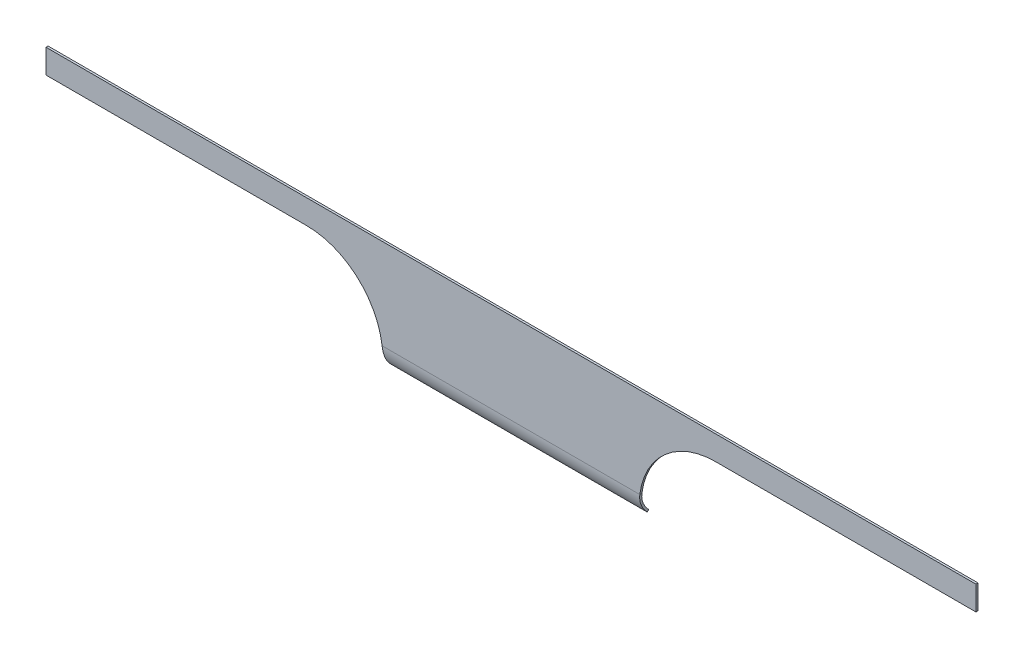
ISO-10303-21;
HEADER;
FILE_DESCRIPTION(('STEP AP214'),'2;1');
FILE_NAME('part.step','',(''),(''),'','','');
FILE_SCHEMA(('AUTOMOTIVE_DESIGN { 1 0 10303 214 1 1 1 1 }'));
ENDSEC;
DATA;
#1=APPLICATION_CONTEXT('core data for automotive mechanical design processes');
#2=APPLICATION_PROTOCOL_DEFINITION('international standard','automotive_design',2000,#1);
#3=PRODUCT_CONTEXT('',#1,'mechanical');
#4=PRODUCT('Part','Part','',(#3));
#5=PRODUCT_RELATED_PRODUCT_CATEGORY('part','',(#4));
#6=PRODUCT_DEFINITION_FORMATION('','',#4);
#7=PRODUCT_DEFINITION_CONTEXT('part definition',#1,'design');
#8=PRODUCT_DEFINITION('design','',#6,#7);
#9=PRODUCT_DEFINITION_SHAPE('','',#8);
#10=(LENGTH_UNIT() NAMED_UNIT(*) SI_UNIT(.MILLI.,.METRE.));
#11=(NAMED_UNIT(*) PLANE_ANGLE_UNIT() SI_UNIT($,.RADIAN.));
#12=(NAMED_UNIT(*) SI_UNIT($,.STERADIAN.) SOLID_ANGLE_UNIT());
#13=UNCERTAINTY_MEASURE_WITH_UNIT(LENGTH_MEASURE(1.E-05),#10,'distance_accuracy_value','');
#14=(GEOMETRIC_REPRESENTATION_CONTEXT(3) GLOBAL_UNCERTAINTY_ASSIGNED_CONTEXT((#13)) GLOBAL_UNIT_ASSIGNED_CONTEXT((#10,
#11,#12)) REPRESENTATION_CONTEXT('',''));
#15=CARTESIAN_POINT('',(0.,0.,0.));
#16=DIRECTION('',(0.,0.,1.));
#17=DIRECTION('',(1.,0.,0.));
#18=AXIS2_PLACEMENT_3D('',#15,#16,#17);
#19=CARTESIAN_POINT('',(749.3,-114.299999999998,-114.299999999998));
#20=DIRECTION('',(-1.,0.,0.));
#21=DIRECTION('',(0.,0.,1.));
#22=AXIS2_PLACEMENT_3D('',#19,#20,#21);
#23=PLANE('',#22);
#24=CARTESIAN_POINT('',(749.299999999999,-114.3,-32.3402844362754));
#25=DIRECTION('',(-1.,0.,0.));
#26=DIRECTION('',(0.,0.,1.));
#27=AXIS2_PLACEMENT_3D('',#24,#25,#26);
#28=CIRCLE('',#27,34.9971244362754);
#29=CARTESIAN_POINT('',(749.300000000001,-127.692819702182,-0.00715747285004106));
#30=VERTEX_POINT('',#29);
#31=CARTESIAN_POINT('',(749.3,-139.046703834143,-7.59358060213253));
#32=VERTEX_POINT('',#31);
#33=EDGE_CURVE('E518',#30,#32,#28,.F.);
#34=ORIENTED_EDGE('',*,*,#33,.T.);
#35=CARTESIAN_POINT('',(749.3,-137.168034430392,-9.47225000588337));
#36=CARTESIAN_POINT('',(749.3,-137.794257623901,-8.84602681237416));
#37=CARTESIAN_POINT('',(749.3,-138.420480817411,-8.21980361886492));
#38=CARTESIAN_POINT('',(749.3,-139.04670401092,-7.59358042535571));
#39=B_SPLINE_CURVE_WITH_KNOTS('',3,(#35,#36,#37,#38),.UNSPECIFIED.,.F.,.F.,(4,4),(0.,1.),.UNSPECIFIED.);
#40=CARTESIAN_POINT('',(749.3,-137.168034430392,-9.47225000588349));
#41=VERTEX_POINT('',#40);
#42=EDGE_CURVE('E436',#41,#32,#39,.T.);
#43=ORIENTED_EDGE('',*,*,#42,.F.);
#44=CARTESIAN_POINT('',(749.299999999999,-114.3,-32.3402844362754));
#45=DIRECTION('',(-1.,0.,0.));
#46=DIRECTION('',(0.,0.,1.));
#47=AXIS2_PLACEMENT_3D('',#44,#45,#46);
#48=CIRCLE('',#47,32.3402844362754);
#49=CARTESIAN_POINT('',(749.300000000001,-126.676091051737,-2.46175757000735));
#50=VERTEX_POINT('',#49);
#51=EDGE_CURVE('E439',#50,#41,#48,.F.);
#52=ORIENTED_EDGE('',*,*,#51,.F.);
#53=DIRECTION('',(0.,0.382683432365078,-0.923879532511291));
#54=VECTOR('',#53,1.);
#55=CARTESIAN_POINT('',(749.300000000002,-127.692819701554,-0.00715747436655367));
#56=LINE('',#55,#54);
#57=EDGE_CURVE('E365',#50,#30,#56,.F.);
#58=ORIENTED_EDGE('',*,*,#57,.T.);
#59=EDGE_LOOP('',(#34,#43,#52,#58));
#60=FACE_BOUND('',#59,.T.);
#61=ADVANCED_FACE('F362',(#60),#23,.F.);
#62=CARTESIAN_POINT('',(752.642105263158,-101.820835351228,-0.265684));
#63=CARTESIAN_POINT('',(752.35165142943,-102.941770559072,-0.265847158777117));
#64=CARTESIAN_POINT('',(751.770743761973,-105.183640974759,-0.266173476331351));
#65=CARTESIAN_POINT('',(751.053633083937,-108.583670187395,-0.263726094674595));
#66=CARTESIAN_POINT('',(750.517192648634,-111.624238479452,-0.271992868014699));
#67=CARTESIAN_POINT('',(750.103683149232,-114.485241778502,-0.249196809285274));
#68=CARTESIAN_POINT('',(749.764194512313,-117.338946878089,-0.352101846930876));
#69=CARTESIAN_POINT('',(749.489318849619,-120.554742577071,-0.820528666951754));
#70=CARTESIAN_POINT('',(749.331781106174,-123.7093110237,-1.62203803450702));
#71=CARTESIAN_POINT('',(749.28850273558,-126.410779792222,-2.60261755904269));
#72=CARTESIAN_POINT('',(749.322884462717,-129.023854877735,-3.79521351634573));
#73=CARTESIAN_POINT('',(749.454288081686,-131.683148461634,-5.3165192780289));
#74=CARTESIAN_POINT('',(749.717888045478,-134.487601966932,-7.31619782676426));
#75=CARTESIAN_POINT('',(749.998744026105,-136.149303159838,-8.87880198615915));
#76=CARTESIAN_POINT('',(750.139174334666,-136.980167472339,-9.66011696393598));
#77=CARTESIAN_POINT('',(752.642105263158,-101.820835351228,0.797052));
#78=CARTESIAN_POINT('',(752.351651429429,-102.941979008405,0.796883435241084));
#79=CARTESIAN_POINT('',(751.770743761973,-105.184266322757,0.796546305723252));
#80=CARTESIAN_POINT('',(751.053633083937,-108.581168795399,0.799074777106988));
#81=CARTESIAN_POINT('',(750.517192648634,-111.632298599494,0.790534098635943));
#82=CARTESIAN_POINT('',(750.103683149232,-114.46417797815,0.814085465052461));
#83=CARTESIAN_POINT('',(749.764194512312,-117.449353090162,0.707770848281948));
#84=CARTESIAN_POINT('',(749.489318849619,-120.759163645919,0.223823521747173));
#85=CARTESIAN_POINT('',(749.331781106173,-124.021693315314,-0.604242462185344));
#86=CARTESIAN_POINT('',(749.28850273558,-126.811931679671,-1.61731178074527));
#87=CARTESIAN_POINT('',(749.322884462716,-129.511749054811,-2.84942232716383));
#88=CARTESIAN_POINT('',(749.454288081687,-132.259094864788,-4.42113390460006));
#89=CARTESIAN_POINT('',(749.717888045478,-135.15648646759,-6.48706831789067));
#90=CARTESIAN_POINT('',(749.998744026105,-136.873242911906,-8.1014466434903));
#91=CARTESIAN_POINT('',(750.139174334666,-137.73163530455,-8.90864913172489));
#92=CARTESIAN_POINT('',(752.642105263158,-101.820835351228,1.859788));
#93=CARTESIAN_POINT('',(752.351651429429,-102.942187457737,1.85961402925928));
#94=CARTESIAN_POINT('',(751.770743761973,-105.184891670756,1.85926608777785));
#95=CARTESIAN_POINT('',(751.053633083937,-108.578667403404,1.86187564888858));
#96=CARTESIAN_POINT('',(750.517192648634,-111.640358719535,1.85306106528659));
#97=CARTESIAN_POINT('',(750.103683149232,-114.443114177799,1.87736773939019));
#98=CARTESIAN_POINT('',(749.764194512312,-117.559759302236,1.76764354349477));
#99=CARTESIAN_POINT('',(749.489318849619,-120.963584714768,1.26817571044609));
#100=CARTESIAN_POINT('',(749.331781106174,-124.334075606928,0.413553110136556));
#101=CARTESIAN_POINT('',(749.28850273558,-127.213083567119,-0.632006002447921));
#102=CARTESIAN_POINT('',(749.322884462716,-129.999643231887,-1.90363113798154));
#103=CARTESIAN_POINT('',(749.454288081687,-132.835041267942,-3.52574853117141));
#104=CARTESIAN_POINT('',(749.717888045478,-135.825370968247,-5.65793880901705));
#105=CARTESIAN_POINT('',(749.998744026105,-137.597182663974,-7.32409130082148));
#106=CARTESIAN_POINT('',(750.139174334666,-138.483103136761,-8.15718129951385));
#107=CARTESIAN_POINT('',(752.642105263158,-101.820835351228,2.922524));
#108=CARTESIAN_POINT('',(752.35165142943,-102.94239590707,2.92234462327749));
#109=CARTESIAN_POINT('',(751.770743761973,-105.185517018755,2.92198586983246));
#110=CARTESIAN_POINT('',(751.053633083937,-108.576166011408,2.92467652067016));
#111=CARTESIAN_POINT('',(750.517192648634,-111.648418839576,2.91558803193723));
#112=CARTESIAN_POINT('',(750.103683149232,-114.422050377447,2.94065001372793));
#113=CARTESIAN_POINT('',(749.764194512313,-117.67016551431,2.8275162387076));
#114=CARTESIAN_POINT('',(749.489318849619,-121.168005783616,2.31252789914504));
#115=CARTESIAN_POINT('',(749.331781106174,-124.646457898543,1.43134868245818));
#116=CARTESIAN_POINT('',(749.28850273558,-127.614235454568,0.353299775849551));
#117=CARTESIAN_POINT('',(749.322884462717,-130.487537408963,-0.957839948799706));
#118=CARTESIAN_POINT('',(749.454288081686,-133.410987671096,-2.63036315774251));
#119=CARTESIAN_POINT('',(749.717888045478,-136.494255468905,-4.82880930014346));
#120=CARTESIAN_POINT('',(749.998744026105,-138.321122416041,-6.54673595815262));
#121=CARTESIAN_POINT('',(750.139174334666,-139.234570968972,-7.40571346730275));
#122=B_SPLINE_SURFACE_WITH_KNOTS('',3,3,((#62,#63,#64,#65,#66,#67,#68,#69,#70,#71,#72,#73,#74,
#75,#76),(#77,#78,#79,#80,#81,#82,#83,#84,#85,#86,#87,#88,#89,#90,#91),(#92,#93,#94,#95,#96,#97,
#98,#99,#100,#101,#102,#103,#104,#105,#106),(#107,#108,#109,#110,#111,#112,#113,#114,#115,#116,
#117,#118,#119,#120,#121)),.UNSPECIFIED.,.F.,.F.,.F.,(4,4),(4,1,1,1,1,1,1,1,1,1,1,1,4),(0.,1.),
(0.,0.0912904484822667,0.182580896964533,0.273871345446799,0.334733469237831,0.410342055574255,
0.50105502548557,0.591765935503214,0.66736995496146,0.727861231753743,0.818571907646757,
0.909284456275887,1.),.UNSPECIFIED.);
#123=CARTESIAN_POINT('',(750.139174343774,-114.299999931334,0.));
#124=CARTESIAN_POINT('',(750.103704632582,-114.567432528298,1.57905755249053E-07));
#125=CARTESIAN_POINT('',(750.069355485839,-114.835001038879,-0.00331745296929931));
#126=CARTESIAN_POINT('',(750.002885611845,-115.370251015036,-0.0166053083627542));
#127=CARTESIAN_POINT('',(749.970764896204,-115.637932481192,-0.0265755875363228));
#128=CARTESIAN_POINT('',(749.877731267279,-116.440865854028,-0.066489132934349));
#129=CARTESIAN_POINT('',(749.820141844401,-116.976044714273,-0.106435102235734));
#130=CARTESIAN_POINT('',(749.71459912258,-118.038904471104,-0.212464674561346));
#131=CARTESIAN_POINT('',(749.666549472877,-118.566604399469,-0.278264552878381));
#132=CARTESIAN_POINT('',(749.579312664754,-119.618830451784,-0.435942625497227));
#133=CARTESIAN_POINT('',(749.540125336735,-120.143356636284,-0.527820320672228));
#134=CARTESIAN_POINT('',(749.471326601256,-121.176270593268,-0.73518623304615));
#135=CARTESIAN_POINT('',(749.441523093267,-121.684759187824,-0.8501091513582));
#136=CARTESIAN_POINT('',(749.390361852085,-122.695986422047,-1.10451566553655));
#137=CARTESIAN_POINT('',(749.369004112088,-123.198725066346,-1.24399924161832));
#138=CARTESIAN_POINT('',(749.334594954039,-124.20239771723,-1.54881801168919));
#139=CARTESIAN_POINT('',(749.321633566924,-124.70325669753,-1.71441047311375));
#140=CARTESIAN_POINT('',(749.304346959965,-125.696424502577,-2.06993610885764));
#141=CARTESIAN_POINT('',(749.300021941288,-126.188733127894,-2.25986985004641));
#142=CARTESIAN_POINT('',(749.3,-126.676091051737,-2.46175757000738));
#143=B_SPLINE_CURVE_WITH_KNOTS('',3,(#123,#124,#125,#126,#127,#128,#129,#130,#131,#132,#133,
#134,#135,#136,#137,#138,#139,#140,#141,#142),.UNSPECIFIED.,.F.,.F.,(4,2,2,2,2,2,2,2,2,4),(0.,
0.8092754944921,1.61855520470578,3.23699983418201,4.83815836895134,6.43928625977264,
8.00510837122301,9.57092922135052,11.1532734279099,12.735654491431),.UNSPECIFIED.);
#144=CARTESIAN_POINT('',(750.13917433922,-114.299999965667,0.));
#145=VERTEX_POINT('',#144);
#146=EDGE_CURVE('E431',#145,#50,#143,.T.);
#147=DIRECTION('',(0.,0.,1.));
#148=VECTOR('',#147,1.);
#149=CARTESIAN_POINT('',(750.139174334666,-114.3,0.));
#150=LINE('',#149,#148);
#151=CARTESIAN_POINT('',(750.13917433906,-114.299999965647,2.65684000000067));
#152=VERTEX_POINT('',#151);
#153=EDGE_CURVE('E460',#145,#152,#150,.T.);
#154=CARTESIAN_POINT('',(750.139174343453,-114.299999931295,2.65684));
#155=CARTESIAN_POINT('',(750.105043301277,-114.56722252938,2.65684201995193));
#156=CARTESIAN_POINT('',(750.0725448687,-114.834647522195,2.65377949819717));
#157=CARTESIAN_POINT('',(750.010282157964,-115.369667740193,2.64151209395863));
#158=CARTESIAN_POINT('',(749.980517799248,-115.637262960128,2.63230739250981));
#159=CARTESIAN_POINT('',(749.923191054517,-116.172397084951,2.6077427098769));
#160=CARTESIAN_POINT('',(749.895628604594,-116.43993599125,2.59238290741219));
#161=CARTESIAN_POINT('',(749.842370922068,-116.974777101442,2.55550526347968));
#162=CARTESIAN_POINT('',(749.81667570805,-117.242079302953,2.53398736073151));
#163=CARTESIAN_POINT('',(749.767191558973,-117.773669137117,2.4850352582151));
#164=CARTESIAN_POINT('',(749.743386482676,-118.037960755045,2.457660777381));
#165=CARTESIAN_POINT('',(749.697527426828,-118.565994840963,2.39688069045409));
#166=CARTESIAN_POINT('',(749.67547343381,-118.829737313161,2.36347513075089));
#167=CARTESIAN_POINT('',(749.612046726469,-119.619945835163,2.25421918153419));
#168=CARTESIAN_POINT('',(749.573407541773,-120.145411596573,2.16932780960912));
#169=CARTESIAN_POINT('',(749.498959715884,-121.266041357752,1.96192752679411));
#170=CARTESIAN_POINT('',(749.464313288404,-121.860615019241,1.83580734576511));
#171=CARTESIAN_POINT('',(749.404908240227,-123.042880898255,1.55263946507261));
#172=CARTESIAN_POINT('',(749.380150117875,-123.630572767509,1.39559020726272));
#173=CARTESIAN_POINT('',(749.3402152506,-124.803814843392,1.04903728633412));
#174=CARTESIAN_POINT('',(749.325148983596,-125.389267251452,0.859189660476841));
#175=CARTESIAN_POINT('',(749.305048787002,-126.549495251603,0.448854424367313));
#176=CARTESIAN_POINT('',(749.300014646462,-127.124271067947,0.228367458491751));
#177=CARTESIAN_POINT('',(749.3,-127.692819702182,-0.00715747285006353));
#178=B_SPLINE_CURVE_WITH_KNOTS('',3,(#154,#155,#156,#157,#158,#159,#160,#161,#162,#163,#164,
#165,#166,#167,#168,#169,#170,#171,#172,#173,#174,#175,#176,#177),.UNSPECIFIED.,.F.,.F.,(4,2,2,
2,2,2,2,2,2,2,2,4),(0.,0.808149184674305,1.61627455096609,2.42437645424765,3.23248639937682,
4.03271861271704,4.83294467112422,6.43334054783391,8.25879952081505,10.084350480384,
11.9303585668227,13.7763278356955),.UNSPECIFIED.);
#179=EDGE_CURVE('E432',#152,#30,#178,.T.);
#180=ORIENTED_EDGE('',*,*,#57,.F.);
#181=ORIENTED_EDGE('',*,*,#146,.F.);
#182=ORIENTED_EDGE('',*,*,#153,.T.);
#183=ORIENTED_EDGE('',*,*,#179,.T.);
#184=EDGE_LOOP('',(#180,#181,#182,#183));
#185=FACE_BOUND('',#184,.T.);
#186=ADVANCED_FACE('F429',(#185),#122,.T.);
#187=CARTESIAN_POINT('',(-1.3331028809031E-13,-139.046704010912,-7.59358042535259));
#188=DIRECTION('',(0.,0.707106781186548,0.707106781186547));
#189=DIRECTION('',(0.,-0.707106781186547,0.707106781186548));
#190=AXIS2_PLACEMENT_3D('',#187,#188,#189);
#191=PLANE('',#190);
#192=ORIENTED_EDGE('',*,*,#42,.T.);
#193=DIRECTION('',(-1.,0.,0.));
#194=VECTOR('',#193,1.);
#195=CARTESIAN_POINT('',(750.139174335345,-139.04670401092,-7.59358042535597));
#196=LINE('',#195,#194);
#197=CARTESIAN_POINT('',(425.450000000001,-139.046704010918,-7.59358042535289));
#198=VERTEX_POINT('',#197);
#199=EDGE_CURVE('E577',#198,#32,#196,.F.);
#200=ORIENTED_EDGE('',*,*,#199,.F.);
#201=CARTESIAN_POINT('',(425.450000000002,-137.168034430389,-9.47225000588202));
#202=CARTESIAN_POINT('',(425.450000000002,-137.794257623898,-8.84602681237281));
#203=CARTESIAN_POINT('',(425.450000000002,-138.420480817407,-8.21980361886359));
#204=CARTESIAN_POINT('',(425.450000000002,-139.046704010917,-7.59358042535438));
#205=B_SPLINE_CURVE_WITH_KNOTS('',3,(#201,#202,#203,#204),.UNSPECIFIED.,.F.,.F.,(4,4),(0.,1.),.UNSPECIFIED.);
#206=CARTESIAN_POINT('',(425.450000000001,-137.16803443039,-9.47225000588065));
#207=VERTEX_POINT('',#206);
#208=EDGE_CURVE('E585',#207,#198,#205,.T.);
#209=ORIENTED_EDGE('',*,*,#208,.F.);
#210=DIRECTION('',(1.,0.,0.));
#211=VECTOR('',#210,1.);
#212=CARTESIAN_POINT('',(-1.2234711970686E-13,-137.168034430384,-9.47225000588052));
#213=LINE('',#212,#211);
#214=EDGE_CURVE('E442',#207,#41,#213,.T.);
#215=ORIENTED_EDGE('',*,*,#214,.T.);
#216=EDGE_LOOP('',(#192,#200,#209,#215));
#217=FACE_BOUND('',#216,.T.);
#218=ADVANCED_FACE('F526',(#217),#191,.F.);
#219=CARTESIAN_POINT('',(845.82,-127.,0.));
#220=DIRECTION('',(0.,0.,1.));
#221=DIRECTION('',(1.,0.,0.));
#222=AXIS2_PLACEMENT_3D('',#219,#220,#221);
#223=CYLINDRICAL_SURFACE('',#222,96.52);
#224=DIRECTION('',(0.,0.,1.));
#225=VECTOR('',#224,1.);
#226=CARTESIAN_POINT('',(845.82,-30.4799999999999,0.));
#227=LINE('',#226,#225);
#228=CARTESIAN_POINT('',(845.82,-30.4799999999999,0.));
#229=VERTEX_POINT('',#228);
#230=CARTESIAN_POINT('',(845.82,-30.4799999999999,2.65684));
#231=VERTEX_POINT('',#230);
#232=EDGE_CURVE('E457',#229,#231,#227,.T.);
#233=ORIENTED_EDGE('',*,*,#232,.T.);
#234=CARTESIAN_POINT('',(845.82,-127.,2.65684));
#235=DIRECTION('',(0.,0.,1.));
#236=DIRECTION('',(1.,0.,0.));
#237=AXIS2_PLACEMENT_3D('',#234,#235,#236);
#238=CIRCLE('',#237,96.52);
#239=EDGE_CURVE('E567',#231,#152,#238,.T.);
#240=ORIENTED_EDGE('',*,*,#239,.T.);
#241=ORIENTED_EDGE('',*,*,#153,.F.);
#242=CARTESIAN_POINT('',(845.82,-127.,0.));
#243=DIRECTION('',(0.,0.,1.));
#244=DIRECTION('',(1.,0.,0.));
#245=AXIS2_PLACEMENT_3D('',#242,#243,#244);
#246=CIRCLE('',#245,96.52);
#247=EDGE_CURVE('E575',#229,#145,#246,.T.);
#248=ORIENTED_EDGE('',*,*,#247,.F.);
#249=EDGE_LOOP('',(#233,#240,#241,#248));
#250=FACE_BOUND('',#249,.T.);
#251=ADVANCED_FACE('F535',(#250),#223,.F.);
#252=CARTESIAN_POINT('',(0.,-30.48,0.));
#253=DIRECTION('',(0.,-1.,0.));
#254=DIRECTION('',(1.,0.,0.));
#255=AXIS2_PLACEMENT_3D('',#252,#253,#254);
#256=PLANE('',#255);
#257=CARTESIAN_POINT('',(845.82,-30.4799999999999,2.65684));
#258=CARTESIAN_POINT('',(955.463333333333,-30.48,2.65684));
#259=CARTESIAN_POINT('',(1065.10666666667,-30.48,2.65684));
#260=CARTESIAN_POINT('',(1174.75,-30.48,2.65684));
#261=B_SPLINE_CURVE_WITH_KNOTS('',3,(#257,#258,#259,#260),.UNSPECIFIED.,.F.,.F.,(4,4),(0.,1.),.UNSPECIFIED.);
#262=CARTESIAN_POINT('',(1174.74999983333,-30.48,2.65683983333333));
#263=VERTEX_POINT('',#262);
#264=EDGE_CURVE('E570',#231,#263,#261,.T.);
#265=ORIENTED_EDGE('',*,*,#264,.F.);
#266=ORIENTED_EDGE('',*,*,#232,.F.);
#267=CARTESIAN_POINT('',(845.82,-30.4799999999999,0.));
#268=CARTESIAN_POINT('',(955.463333333333,-30.48,0.));
#269=CARTESIAN_POINT('',(1065.10666666667,-30.48,0.));
#270=CARTESIAN_POINT('',(1174.75,-30.48,0.));
#271=B_SPLINE_CURVE_WITH_KNOTS('',3,(#267,#268,#269,#270),.UNSPECIFIED.,.F.,.F.,(4,4),(0.,1.),.UNSPECIFIED.);
#272=CARTESIAN_POINT('',(1174.74999983333,-30.48,0.));
#273=VERTEX_POINT('',#272);
#274=EDGE_CURVE('E576',#229,#273,#271,.T.);
#275=ORIENTED_EDGE('',*,*,#274,.T.);
#276=CARTESIAN_POINT('',(1174.75,-30.48,0.));
#277=CARTESIAN_POINT('',(1174.75,-30.48,0.885613333333333));
#278=CARTESIAN_POINT('',(1174.75,-30.48,1.77122666666667));
#279=CARTESIAN_POINT('',(1174.75,-30.48,2.65684));
#280=B_SPLINE_CURVE_WITH_KNOTS('',3,(#276,#277,#278,#279),.UNSPECIFIED.,.F.,.F.,(4,4),(0.,1.),.UNSPECIFIED.);
#281=EDGE_CURVE('E459',#273,#263,#280,.T.);
#282=ORIENTED_EDGE('',*,*,#281,.T.);
#283=EDGE_LOOP('',(#265,#266,#275,#282));
#284=FACE_BOUND('',#283,.T.);
#285=ADVANCED_FACE('F538',(#284),#256,.T.);
#286=CARTESIAN_POINT('',(1174.75,0.,2.65684));
#287=DIRECTION('',(-1.,0.,0.));
#288=DIRECTION('',(0.,0.,1.));
#289=AXIS2_PLACEMENT_3D('',#286,#287,#288);
#290=PLANE('',#289);
#291=CARTESIAN_POINT('',(1174.75,-30.48,0.));
#292=CARTESIAN_POINT('',(1174.75,-20.32,0.));
#293=CARTESIAN_POINT('',(1174.75,-10.16,0.));
#294=CARTESIAN_POINT('',(1174.75,0.,0.));
#295=B_SPLINE_CURVE_WITH_KNOTS('',3,(#291,#292,#293,#294),.UNSPECIFIED.,.F.,.F.,(4,4),(0.,1.),.UNSPECIFIED.);
#296=CARTESIAN_POINT('',(1174.75,-1.66666694099149E-07,0.));
#297=VERTEX_POINT('',#296);
#298=EDGE_CURVE('E693',#273,#297,#295,.T.);
#299=ORIENTED_EDGE('',*,*,#298,.T.);
#300=CARTESIAN_POINT('',(1174.75,0.,2.65684));
#301=CARTESIAN_POINT('',(1174.75,0.,1.77122666666667));
#302=CARTESIAN_POINT('',(1174.75,0.,0.885613333333333));
#303=CARTESIAN_POINT('',(1174.75,0.,0.));
#304=B_SPLINE_CURVE_WITH_KNOTS('',3,(#300,#301,#302,#303),.UNSPECIFIED.,.F.,.F.,(4,4),(0.,1.),.UNSPECIFIED.);
#305=CARTESIAN_POINT('',(1174.75,-1.66666694099149E-07,2.65684));
#306=VERTEX_POINT('',#305);
#307=EDGE_CURVE('E448',#306,#297,#304,.T.);
#308=ORIENTED_EDGE('',*,*,#307,.F.);
#309=CARTESIAN_POINT('',(1174.75,-30.48,2.65684));
#310=CARTESIAN_POINT('',(1174.75,-20.32,2.65684));
#311=CARTESIAN_POINT('',(1174.75,-10.16,2.65684));
#312=CARTESIAN_POINT('',(1174.75,0.,2.65684));
#313=B_SPLINE_CURVE_WITH_KNOTS('',3,(#309,#310,#311,#312),.UNSPECIFIED.,.F.,.F.,(4,4),(0.,1.),.UNSPECIFIED.);
#314=EDGE_CURVE('E628',#263,#306,#313,.T.);
#315=ORIENTED_EDGE('',*,*,#314,.F.);
#316=ORIENTED_EDGE('',*,*,#281,.F.);
#317=EDGE_LOOP('',(#299,#308,#315,#316));
#318=FACE_BOUND('',#317,.T.);
#319=ADVANCED_FACE('F542',(#318),#290,.F.);
#320=CARTESIAN_POINT('',(0.,0.,2.65684));
#321=DIRECTION('',(0.,-1.,0.));
#322=DIRECTION('',(0.,0.,-1.));
#323=AXIS2_PLACEMENT_3D('',#320,#321,#322);
#324=PLANE('',#323);
#325=CARTESIAN_POINT('',(1174.75,0.,0.));
#326=CARTESIAN_POINT('',(783.166666666667,0.,0.));
#327=CARTESIAN_POINT('',(391.583333333333,0.,0.));
#328=CARTESIAN_POINT('',(0.,0.,0.));
#329=B_SPLINE_CURVE_WITH_KNOTS('',3,(#325,#326,#327,#328),.UNSPECIFIED.,.F.,.F.,(4,4),(0.,1.),.UNSPECIFIED.);
#330=CARTESIAN_POINT('',(0.,0.,0.));
#331=VERTEX_POINT('',#330);
#332=EDGE_CURVE('E702',#297,#331,#329,.T.);
#333=ORIENTED_EDGE('',*,*,#332,.T.);
#334=CARTESIAN_POINT('',(0.,0.,2.65684));
#335=CARTESIAN_POINT('',(0.,0.,1.77122666666667));
#336=CARTESIAN_POINT('',(0.,0.,0.885613333333333));
#337=CARTESIAN_POINT('',(0.,0.,0.));
#338=B_SPLINE_CURVE_WITH_KNOTS('',3,(#334,#335,#336,#337),.UNSPECIFIED.,.F.,.F.,(4,4),(0.,1.),.UNSPECIFIED.);
#339=CARTESIAN_POINT('',(0.,0.,2.65684));
#340=VERTEX_POINT('',#339);
#341=EDGE_CURVE('E445',#340,#331,#338,.T.);
#342=ORIENTED_EDGE('',*,*,#341,.F.);
#343=CARTESIAN_POINT('',(1174.75,0.,2.65684));
#344=CARTESIAN_POINT('',(783.166666666667,0.,2.65684));
#345=CARTESIAN_POINT('',(391.583333333333,0.,2.65684));
#346=CARTESIAN_POINT('',(0.,0.,2.65684));
#347=B_SPLINE_CURVE_WITH_KNOTS('',3,(#343,#344,#345,#346),.UNSPECIFIED.,.F.,.F.,(4,4),(0.,1.),.UNSPECIFIED.);
#348=EDGE_CURVE('E632',#306,#340,#347,.T.);
#349=ORIENTED_EDGE('',*,*,#348,.F.);
#350=ORIENTED_EDGE('',*,*,#307,.T.);
#351=EDGE_LOOP('',(#333,#342,#349,#350));
#352=FACE_BOUND('',#351,.T.);
#353=ADVANCED_FACE('F546',(#352),#324,.F.);
#354=CARTESIAN_POINT('',(0.,0.,2.65684));
#355=DIRECTION('',(1.,0.,0.));
#356=DIRECTION('',(0.,1.,0.));
#357=AXIS2_PLACEMENT_3D('',#354,#355,#356);
#358=PLANE('',#357);
#359=CARTESIAN_POINT('',(0.,-30.48,0.));
#360=CARTESIAN_POINT('',(0.,-30.48,0.885613333333333));
#361=CARTESIAN_POINT('',(0.,-30.48,1.77122666666667));
#362=CARTESIAN_POINT('',(0.,-30.48,2.65684));
#363=B_SPLINE_CURVE_WITH_KNOTS('',3,(#359,#360,#361,#362),.UNSPECIFIED.,.F.,.F.,(4,4),(0.,1.),.UNSPECIFIED.);
#364=CARTESIAN_POINT('',(0.,-30.48,0.));
#365=VERTEX_POINT('',#364);
#366=CARTESIAN_POINT('',(0.,-30.48,2.65684));
#367=VERTEX_POINT('',#366);
#368=EDGE_CURVE('E573',#365,#367,#363,.T.);
#369=ORIENTED_EDGE('',*,*,#368,.T.);
#370=CARTESIAN_POINT('',(0.,0.,2.65684));
#371=CARTESIAN_POINT('',(0.,-10.16,2.65684));
#372=CARTESIAN_POINT('',(0.,-20.32,2.65684));
#373=CARTESIAN_POINT('',(0.,-30.48,2.65684));
#374=B_SPLINE_CURVE_WITH_KNOTS('',3,(#370,#371,#372,#373),.UNSPECIFIED.,.F.,.F.,(4,4),(0.,1.),.UNSPECIFIED.);
#375=EDGE_CURVE('E634',#340,#367,#374,.T.);
#376=ORIENTED_EDGE('',*,*,#375,.F.);
#377=ORIENTED_EDGE('',*,*,#341,.T.);
#378=CARTESIAN_POINT('',(0.,0.,0.));
#379=CARTESIAN_POINT('',(0.,-10.16,0.));
#380=CARTESIAN_POINT('',(0.,-20.32,0.));
#381=CARTESIAN_POINT('',(0.,-30.48,0.));
#382=B_SPLINE_CURVE_WITH_KNOTS('',3,(#378,#379,#380,#381),.UNSPECIFIED.,.F.,.F.,(4,4),(0.,1.),.UNSPECIFIED.);
#383=EDGE_CURVE('E574',#331,#365,#382,.T.);
#384=ORIENTED_EDGE('',*,*,#383,.T.);
#385=EDGE_LOOP('',(#369,#376,#377,#384));
#386=FACE_BOUND('',#385,.T.);
#387=ADVANCED_FACE('F550',(#386),#358,.F.);
#388=CARTESIAN_POINT('',(750.139174335345,-114.3,-32.3402844362754));
#389=DIRECTION('',(-1.,0.,0.));
#390=DIRECTION('',(0.,1.,0.));
#391=AXIS2_PLACEMENT_3D('',#388,#389,#390);
#392=CYLINDRICAL_SURFACE('',#391,32.3402844362754);
#393=ORIENTED_EDGE('',*,*,#51,.T.);
#394=ORIENTED_EDGE('',*,*,#214,.F.);
#395=CARTESIAN_POINT('',(425.45,-114.3,-32.3402844362708));
#396=DIRECTION('',(-1.,0.,0.));
#397=DIRECTION('',(0.,0.,1.));
#398=AXIS2_PLACEMENT_3D('',#395,#396,#397);
#399=CIRCLE('',#398,32.3402844362754);
#400=CARTESIAN_POINT('',(425.45,-126.676091051737,-2.4617575700028));
#401=VERTEX_POINT('',#400);
#402=EDGE_CURVE('E587',#401,#207,#399,.F.);
#403=ORIENTED_EDGE('',*,*,#402,.F.);
#404=CARTESIAN_POINT('',(425.45,-126.676091051737,-2.4617575700028));
#405=CARTESIAN_POINT('',(425.449978408202,-126.177552121311,-2.25523680500284));
#406=CARTESIAN_POINT('',(425.445452822347,-125.673831900739,-2.061226259867));
#407=CARTESIAN_POINT('',(425.427363252606,-124.657469588283,-1.69868498919827));
#408=CARTESIAN_POINT('',(425.413799368427,-124.144827594881,-1.53015398260876));
#409=CARTESIAN_POINT('',(425.377796004415,-123.117564174479,-1.22068733963327));
#410=CARTESIAN_POINT('',(425.355452823428,-122.603022305089,-1.07947631154163));
#411=CARTESIAN_POINT('',(425.301936245893,-121.568025494805,-0.822764611851254));
#412=CARTESIAN_POINT('',(425.270762970236,-121.047570634957,-0.707263588302028));
#413=CARTESIAN_POINT('',(425.20039814948,-120.01384804432,-0.504500541501392));
#414=CARTESIAN_POINT('',(425.161401226343,-119.500679390148,-0.41666545967775));
#415=CARTESIAN_POINT('',(425.074930769945,-118.471406584396,-0.265934740704573));
#416=CARTESIAN_POINT('',(425.027457203614,-117.955302421371,-0.203039200849597));
#417=CARTESIAN_POINT('',(424.923482633631,-116.916025234642,-0.101707591068067));
#418=CARTESIAN_POINT('',(424.866891634899,-116.392835096979,-0.063536696029955));
#419=CARTESIAN_POINT('',(424.77565254302,-115.607910718973,-0.0253959538299353));
#420=CARTESIAN_POINT('',(424.744179341492,-115.346235449013,-0.015868307775285));
#421=CARTESIAN_POINT('',(424.679103119515,-114.82299670352,-0.00317026947940485));
#422=CARTESIAN_POINT('',(424.645500108844,-114.561433227479,1.51945144916998E-07));
#423=CARTESIAN_POINT('',(424.610825665915,-114.300000004384,4.58465743869482E-12));
#424=B_SPLINE_CURVE_WITH_KNOTS('',3,(#404,#405,#406,#407,#408,#409,#410,#411,#412,#413,#414,
#415,#416,#417,#418,#419,#420,#421,#422,#423),.UNSPECIFIED.,.F.,.F.,(4,2,2,2,2,2,2,2,2,4),(0.,
1.61867779352398,3.23733773062811,4.83871738119336,6.440075108736,8.00566939479602,
9.57126978851865,11.153394979983,11.9445217484835,12.7356448852485),.UNSPECIFIED.);
#425=CARTESIAN_POINT('',(424.610825665625,-114.300000002192,1.61825441266018E-12));
#426=VERTEX_POINT('',#425);
#427=EDGE_CURVE('E557',#401,#426,#424,.T.);
#428=ORIENTED_EDGE('',*,*,#427,.T.);
#429=DIRECTION('',(1.,0.,0.));
#430=VECTOR('',#429,1.);
#431=CARTESIAN_POINT('',(0.,-114.3,0.));
#432=LINE('',#431,#430);
#433=EDGE_CURVE('E380',#145,#426,#432,.F.);
#434=ORIENTED_EDGE('',*,*,#433,.F.);
#435=ORIENTED_EDGE('',*,*,#146,.T.);
#436=EDGE_LOOP('',(#393,#394,#403,#428,#434,#435));
#437=FACE_BOUND('',#436,.T.);
#438=ADVANCED_FACE('F438',(#437),#392,.F.);
#439=CARTESIAN_POINT('',(425.45,-114.299999999998,-114.299999999999));
#440=DIRECTION('',(-1.,0.,0.));
#441=DIRECTION('',(0.,0.,1.));
#442=AXIS2_PLACEMENT_3D('',#439,#440,#441);
#443=PLANE('',#442);
#444=CARTESIAN_POINT('',(425.45,-114.3,-32.3402844362708));
#445=DIRECTION('',(-1.,0.,0.));
#446=DIRECTION('',(0.,0.,1.));
#447=AXIS2_PLACEMENT_3D('',#444,#445,#446);
#448=CIRCLE('',#447,34.9971244362754);
#449=CARTESIAN_POINT('',(425.450000000001,-127.692819702182,-0.00715747284552384));
#450=VERTEX_POINT('',#449);
#451=EDGE_CURVE('E517',#450,#198,#448,.F.);
#452=ORIENTED_EDGE('',*,*,#451,.F.);
#453=DIRECTION('',(0.,-0.382683432365112,0.923879532511278));
#454=VECTOR('',#453,1.);
#455=CARTESIAN_POINT('',(425.450000000002,-126.676091051735,-2.46175757000687));
#456=LINE('',#455,#454);
#457=EDGE_CURVE('E492',#401,#450,#456,.T.);
#458=ORIENTED_EDGE('',*,*,#457,.F.);
#459=ORIENTED_EDGE('',*,*,#402,.T.);
#460=ORIENTED_EDGE('',*,*,#208,.T.);
#461=EDGE_LOOP('',(#452,#458,#459,#460));
#462=FACE_BOUND('',#461,.T.);
#463=ADVANCED_FACE('F506',(#462),#443,.T.);
#464=CARTESIAN_POINT('',(750.139174335345,-114.3,-32.3402844362754));
#465=DIRECTION('',(-1.,0.,0.));
#466=DIRECTION('',(0.,1.,0.));
#467=AXIS2_PLACEMENT_3D('',#464,#465,#466);
#468=CYLINDRICAL_SURFACE('',#467,34.9971244362754);
#469=ORIENTED_EDGE('',*,*,#33,.F.);
#470=ORIENTED_EDGE('',*,*,#179,.F.);
#471=DIRECTION('',(-1.,0.,0.));
#472=VECTOR('',#471,1.);
#473=CARTESIAN_POINT('',(750.139174335345,-114.3,2.65684));
#474=LINE('',#473,#472);
#475=CARTESIAN_POINT('',(424.61082566563,-114.300000002318,2.65684000000162));
#476=VERTEX_POINT('',#475);
#477=EDGE_CURVE('E563',#152,#476,#474,.T.);
#478=ORIENTED_EDGE('',*,*,#477,.T.);
#479=CARTESIAN_POINT('',(425.45,-127.692819702182,-0.00715747284551428));
#480=CARTESIAN_POINT('',(425.449982025753,-127.19509359942,0.199021425133339));
#481=CARTESIAN_POINT('',(425.446123707139,-126.692599389083,0.39368292845516));
#482=CARTESIAN_POINT('',(425.430720580825,-125.679291048399,0.759570055880585));
#483=CARTESIAN_POINT('',(425.419176118437,-125.168477292825,0.930796732411654));
#484=CARTESIAN_POINT('',(425.38854475168,-124.144709473089,1.24788054431965));
#485=CARTESIAN_POINT('',(425.369532377359,-123.631824670798,1.39396845422116));
#486=CARTESIAN_POINT('',(425.323967269127,-122.600229296157,1.66249499780875));
#487=CARTESIAN_POINT('',(425.297414303453,-122.081518545214,1.78493290440897));
#488=CARTESIAN_POINT('',(425.232308128396,-120.966096371736,2.02148163899683));
#489=CARTESIAN_POINT('',(425.192591948537,-120.368681785868,2.1319951943951));
#490=CARTESIAN_POINT('',(425.125667281561,-119.469453733127,2.27427363246938));
#491=CARTESIAN_POINT('',(425.10213195902,-119.169170791506,2.31778683693787));
#492=CARTESIAN_POINT('',(425.052709183418,-118.567755297618,2.3969716323124));
#493=CARTESIAN_POINT('',(425.026821719843,-118.266622741559,2.43264318816044));
#494=CARTESIAN_POINT('',(424.97254985771,-117.660341589447,2.49648899238361));
#495=CARTESIAN_POINT('',(424.944140668208,-117.355185891654,2.52457448189652));
#496=CARTESIAN_POINT('',(424.885063590214,-116.744462535715,2.57270945295198));
#497=CARTESIAN_POINT('',(424.854395722217,-116.438894881332,2.59275900740365));
#498=CARTESIAN_POINT('',(424.790315989624,-115.827637935655,2.624822399993));
#499=CARTESIAN_POINT('',(424.756904288567,-115.521948652691,2.63683671666104));
#500=CARTESIAN_POINT('',(424.704231402284,-115.063554110734,2.64884347388942));
#501=CARTESIAN_POINT('',(424.686247395,-114.910775280445,2.65184327313676));
#502=CARTESIAN_POINT('',(424.649301474378,-114.605308412458,2.65584162522423));
#503=CARTESIAN_POINT('',(424.630339552084,-114.452620375604,2.65684015973382));
#504=CARTESIAN_POINT('',(424.610825665927,-114.300000004636,2.65684000000458));
#505=B_SPLINE_CURVE_WITH_KNOTS('',3,(#479,#480,#481,#482,#483,#484,#485,#486,#487,#488,#489,
#490,#491,#492,#493,#494,#495,#496,#497,#498,#499,#500,#501,#502,#503,#504),.UNSPECIFIED.,.F.,
.F.,(4,2,2,2,2,2,2,2,2,2,2,2,4),(0.,1.61605927294577,3.23204594694969,4.83229884693046,
6.43260093659204,8.2581332969117,9.1710359628387,10.083942710034,11.0071086004846,
11.9302661149685,12.8533686468561,13.3149433688855,13.776522318682),.UNSPECIFIED.);
#506=EDGE_CURVE('E484',#450,#476,#505,.T.);
#507=ORIENTED_EDGE('',*,*,#506,.F.);
#508=ORIENTED_EDGE('',*,*,#451,.T.);
#509=ORIENTED_EDGE('',*,*,#199,.T.);
#510=EDGE_LOOP('',(#469,#470,#478,#507,#508,#509));
#511=FACE_BOUND('',#510,.T.);
#512=ADVANCED_FACE('F500',(#511),#468,.T.);
#513=CARTESIAN_POINT('',(0.,0.,0.));
#514=DIRECTION('',(0.,0.,1.));
#515=DIRECTION('',(1.,0.,0.));
#516=AXIS2_PLACEMENT_3D('',#513,#514,#515);
#517=PLANE('',#516);
#518=ORIENTED_EDGE('',*,*,#247,.T.);
#519=ORIENTED_EDGE('',*,*,#433,.T.);
#520=CARTESIAN_POINT('',(328.93,-127.,0.));
#521=DIRECTION('',(0.,0.,-1.));
#522=DIRECTION('',(-1.,0.,0.));
#523=AXIS2_PLACEMENT_3D('',#520,#521,#522);
#524=CIRCLE('',#523,96.52);
#525=CARTESIAN_POINT('',(328.92999975,-30.48,0.));
#526=VERTEX_POINT('',#525);
#527=EDGE_CURVE('E482',#426,#526,#524,.F.);
#528=ORIENTED_EDGE('',*,*,#527,.T.);
#529=CARTESIAN_POINT('',(0.,-30.48,0.));
#530=CARTESIAN_POINT('',(109.643333333333,-30.48,0.));
#531=CARTESIAN_POINT('',(219.286666666667,-30.48,0.));
#532=CARTESIAN_POINT('',(328.93,-30.48,0.));
#533=B_SPLINE_CURVE_WITH_KNOTS('',3,(#529,#530,#531,#532),.UNSPECIFIED.,.F.,.F.,(4,4),(0.,1.),.UNSPECIFIED.);
#534=EDGE_CURVE('E571',#365,#526,#533,.T.);
#535=ORIENTED_EDGE('',*,*,#534,.F.);
#536=ORIENTED_EDGE('',*,*,#383,.F.);
#537=ORIENTED_EDGE('',*,*,#332,.F.);
#538=ORIENTED_EDGE('',*,*,#298,.F.);
#539=ORIENTED_EDGE('',*,*,#274,.F.);
#540=EDGE_LOOP('',(#518,#519,#528,#535,#536,#537,#538,#539));
#541=FACE_BOUND('',#540,.T.);
#542=ADVANCED_FACE('F505',(#541),#517,.F.);
#543=CARTESIAN_POINT('',(0.,-30.48,0.));
#544=DIRECTION('',(0.,-1.,0.));
#545=DIRECTION('',(1.,0.,0.));
#546=AXIS2_PLACEMENT_3D('',#543,#544,#545);
#547=PLANE('',#546);
#548=CARTESIAN_POINT('',(0.,-30.48,2.65684));
#549=CARTESIAN_POINT('',(109.643333333333,-30.48,2.65684));
#550=CARTESIAN_POINT('',(219.286666666667,-30.48,2.65684));
#551=CARTESIAN_POINT('',(328.93,-30.48,2.65684));
#552=B_SPLINE_CURVE_WITH_KNOTS('',3,(#548,#549,#550,#551),.UNSPECIFIED.,.F.,.F.,(4,4),(0.,1.),.UNSPECIFIED.);
#553=CARTESIAN_POINT('',(328.929999620607,-30.48,2.65684));
#554=VERTEX_POINT('',#553);
#555=EDGE_CURVE('E566',#367,#554,#552,.T.);
#556=ORIENTED_EDGE('',*,*,#555,.F.);
#557=ORIENTED_EDGE('',*,*,#368,.F.);
#558=ORIENTED_EDGE('',*,*,#534,.T.);
#559=DIRECTION('',(0.,0.,1.));
#560=VECTOR('',#559,1.);
#561=CARTESIAN_POINT('',(328.93,-30.48,0.));
#562=LINE('',#561,#560);
#563=EDGE_CURVE('E479',#526,#554,#562,.T.);
#564=ORIENTED_EDGE('',*,*,#563,.T.);
#565=EDGE_LOOP('',(#556,#557,#558,#564));
#566=FACE_BOUND('',#565,.T.);
#567=ADVANCED_FACE('F729',(#566),#547,.T.);
#568=CARTESIAN_POINT('',(0.,0.,2.65684));
#569=DIRECTION('',(0.,0.,1.));
#570=DIRECTION('',(1.,0.,0.));
#571=AXIS2_PLACEMENT_3D('',#568,#569,#570);
#572=PLANE('',#571);
#573=ORIENTED_EDGE('',*,*,#239,.F.);
#574=ORIENTED_EDGE('',*,*,#264,.T.);
#575=ORIENTED_EDGE('',*,*,#314,.T.);
#576=ORIENTED_EDGE('',*,*,#348,.T.);
#577=ORIENTED_EDGE('',*,*,#375,.T.);
#578=ORIENTED_EDGE('',*,*,#555,.T.);
#579=CARTESIAN_POINT('',(328.93,-127.,2.65684));
#580=DIRECTION('',(0.,0.,-1.));
#581=DIRECTION('',(-1.,0.,0.));
#582=AXIS2_PLACEMENT_3D('',#579,#580,#581);
#583=CIRCLE('',#582,96.52);
#584=EDGE_CURVE('E371',#476,#554,#583,.F.);
#585=ORIENTED_EDGE('',*,*,#584,.F.);
#586=ORIENTED_EDGE('',*,*,#477,.F.);
#587=EDGE_LOOP('',(#573,#574,#575,#576,#577,#578,#585,#586));
#588=FACE_BOUND('',#587,.T.);
#589=ADVANCED_FACE('F735',(#588),#572,.T.);
#590=CARTESIAN_POINT('',(422.107894736842,-101.820835351228,2.922524));
#591=CARTESIAN_POINT('',(422.39834857057,-102.94239590707,2.92234462327749));
#592=CARTESIAN_POINT('',(422.979256238027,-105.185517018755,2.92198586983246));
#593=CARTESIAN_POINT('',(423.696366916063,-108.576166011409,2.92467652067016));
#594=CARTESIAN_POINT('',(424.232807351365,-111.648418839576,2.91558803193723));
#595=CARTESIAN_POINT('',(424.646316850768,-114.422050377447,2.94065001372793));
#596=CARTESIAN_POINT('',(424.985805487687,-117.67016551431,2.82751623870761));
#597=CARTESIAN_POINT('',(425.260681150381,-121.168005783615,2.31252789914512));
#598=CARTESIAN_POINT('',(425.418218893826,-124.646457898541,1.43134868245837));
#599=CARTESIAN_POINT('',(425.46149726442,-127.614235454566,0.353299775849818));
#600=CARTESIAN_POINT('',(425.427115537284,-130.48753740896,-0.95783994879925));
#601=CARTESIAN_POINT('',(425.295711918314,-133.410987671094,-2.63036315774178));
#602=CARTESIAN_POINT('',(425.032111954522,-136.494255468902,-4.82880930014261));
#603=CARTESIAN_POINT('',(424.751255973895,-138.321122416038,-6.5467359581515));
#604=CARTESIAN_POINT('',(424.610825665334,-139.234570968969,-7.4057134673015));
#605=CARTESIAN_POINT('',(422.107894736842,-101.820835351228,1.859788));
#606=CARTESIAN_POINT('',(422.39834857057,-102.942187457737,1.85961402925929));
#607=CARTESIAN_POINT('',(422.979256238027,-105.184891670756,1.85926608777785));
#608=CARTESIAN_POINT('',(423.696366916063,-108.578667403404,1.86187564888857));
#609=CARTESIAN_POINT('',(424.232807351365,-111.640358719535,1.85306106528659));
#610=CARTESIAN_POINT('',(424.646316850768,-114.443114177799,1.87736773939019));
#611=CARTESIAN_POINT('',(424.985805487687,-117.559759302236,1.7676435434948));
#612=CARTESIAN_POINT('',(425.260681150381,-120.963584714767,1.26817571044618));
#613=CARTESIAN_POINT('',(425.418218893826,-124.334075606927,0.41355311013659));
#614=CARTESIAN_POINT('',(425.46149726442,-127.213083567118,-0.632006002447486));
#615=CARTESIAN_POINT('',(425.427115537284,-129.999643231885,-1.90363113798122));
#616=CARTESIAN_POINT('',(425.295711918314,-132.83504126794,-3.52574853117051));
#617=CARTESIAN_POINT('',(425.032111954522,-135.825370968245,-5.65793880901612));
#618=CARTESIAN_POINT('',(424.751255973895,-137.597182663971,-7.32409130082031));
#619=CARTESIAN_POINT('',(424.610825665334,-138.483103136758,-8.15718129951257));
#620=CARTESIAN_POINT('',(422.107894736842,-101.820835351228,0.797051999999999));
#621=CARTESIAN_POINT('',(422.39834857057,-102.941979008405,0.796883435241084));
#622=CARTESIAN_POINT('',(422.979256238026,-105.184266322757,0.796546305723253));
#623=CARTESIAN_POINT('',(423.696366916063,-108.581168795399,0.799074777106996));
#624=CARTESIAN_POINT('',(424.232807351365,-111.632298599494,0.790534098635941));
#625=CARTESIAN_POINT('',(424.646316850768,-114.46417797815,0.814085465052463));
#626=CARTESIAN_POINT('',(424.985805487687,-117.449353090162,0.707770848281952));
#627=CARTESIAN_POINT('',(425.260681150381,-120.759163645918,0.223823521747278));
#628=CARTESIAN_POINT('',(425.418218893826,-124.021693315313,-0.604242462185089));
#629=CARTESIAN_POINT('',(425.46149726442,-126.811931679669,-1.61731178074508));
#630=CARTESIAN_POINT('',(425.427115537284,-129.511749054808,-2.84942232716331));
#631=CARTESIAN_POINT('',(425.295711918314,-132.259094864786,-4.42113390459947));
#632=CARTESIAN_POINT('',(425.032111954522,-135.156486467587,-6.48706831788984));
#633=CARTESIAN_POINT('',(424.751255973895,-136.873242911903,-8.10144664348919));
#634=CARTESIAN_POINT('',(424.610825665334,-137.731635304547,-8.90864913172365));
#635=CARTESIAN_POINT('',(422.107894736842,-101.820835351228,-0.265684));
#636=CARTESIAN_POINT('',(422.39834857057,-102.941770559072,-0.265847158777117));
#637=CARTESIAN_POINT('',(422.979256238026,-105.183640974759,-0.266173476331351));
#638=CARTESIAN_POINT('',(423.696366916063,-108.583670187395,-0.263726094674594));
#639=CARTESIAN_POINT('',(424.232807351365,-111.624238479452,-0.271992868014699));
#640=CARTESIAN_POINT('',(424.646316850768,-114.485241778501,-0.249196809285273));
#641=CARTESIAN_POINT('',(424.985805487687,-117.338946878088,-0.352101846930865));
#642=CARTESIAN_POINT('',(425.260681150381,-120.55474257707,-0.820528666951678));
#643=CARTESIAN_POINT('',(425.418218893826,-123.709311023698,-1.62203803450683));
#644=CARTESIAN_POINT('',(425.46149726442,-126.41077979222,-2.60261755904239));
#645=CARTESIAN_POINT('',(425.427115537284,-129.023854877733,-3.79521351634526));
#646=CARTESIAN_POINT('',(425.295711918314,-131.683148461631,-5.31651927802822));
#647=CARTESIAN_POINT('',(425.032111954522,-134.48760196693,-7.31619782676334));
#648=CARTESIAN_POINT('',(424.751255973895,-136.149303159835,-8.87880198615799));
#649=CARTESIAN_POINT('',(424.610825665334,-136.980167472336,-9.66011696393471));
#650=B_SPLINE_SURFACE_WITH_KNOTS('',3,3,((#590,#591,#592,#593,#594,#595,#596,#597,#598,#599,
#600,#601,#602,#603,#604),(#605,#606,#607,#608,#609,#610,#611,#612,#613,#614,#615,#616,#617,
#618,#619),(#620,#621,#622,#623,#624,#625,#626,#627,#628,#629,#630,#631,#632,#633,#634),(#635,
#636,#637,#638,#639,#640,#641,#642,#643,#644,#645,#646,#647,#648,#649)),.UNSPECIFIED.,.F.,.F.,
.F.,(4,4),(4,1,1,1,1,1,1,1,1,1,1,1,4),(0.,1.),(0.,0.0912904484822749,0.18258089696455,
0.273871345446825,0.334733469237862,0.410342055574283,0.501055025485594,0.591765935503233,
0.667369954961474,0.727861231753757,0.818571907646767,0.909284456275891,1.),.UNSPECIFIED.);
#651=DIRECTION('',(0.,0.,-1.));
#652=VECTOR('',#651,1.);
#653=CARTESIAN_POINT('',(424.610825665334,-114.3,0.));
#654=LINE('',#653,#652);
#655=EDGE_CURVE('E13',#476,#426,#654,.T.);
#656=ORIENTED_EDGE('',*,*,#427,.F.);
#657=ORIENTED_EDGE('',*,*,#457,.T.);
#658=ORIENTED_EDGE('',*,*,#506,.T.);
#659=ORIENTED_EDGE('',*,*,#655,.T.);
#660=EDGE_LOOP('',(#656,#657,#658,#659));
#661=FACE_BOUND('',#660,.T.);
#662=ADVANCED_FACE('F494',(#661),#650,.T.);
#663=CARTESIAN_POINT('',(328.93,-127.,0.));
#664=DIRECTION('',(0.,0.,-1.));
#665=DIRECTION('',(-1.,0.,0.));
#666=AXIS2_PLACEMENT_3D('',#663,#664,#665);
#667=CYLINDRICAL_SURFACE('',#666,96.52);
#668=ORIENTED_EDGE('',*,*,#527,.F.);
#669=ORIENTED_EDGE('',*,*,#655,.F.);
#670=ORIENTED_EDGE('',*,*,#584,.T.);
#671=ORIENTED_EDGE('',*,*,#563,.F.);
#672=EDGE_LOOP('',(#668,#669,#670,#671));
#673=FACE_BOUND('',#672,.T.);
#674=ADVANCED_FACE('F731',(#673),#667,.F.);
#675=CLOSED_SHELL('',(#61,#186,#218,#251,#285,#319,#353,#387,#438,#463,#512,#542,#567,#589,#662,#674));
#676=MANIFOLD_SOLID_BREP('B2',#675);
#677=ADVANCED_BREP_SHAPE_REPRESENTATION('',(#18,#676),#14);
#678=SHAPE_DEFINITION_REPRESENTATION(#9,#677);
ENDSEC;
END-ISO-10303-21;
